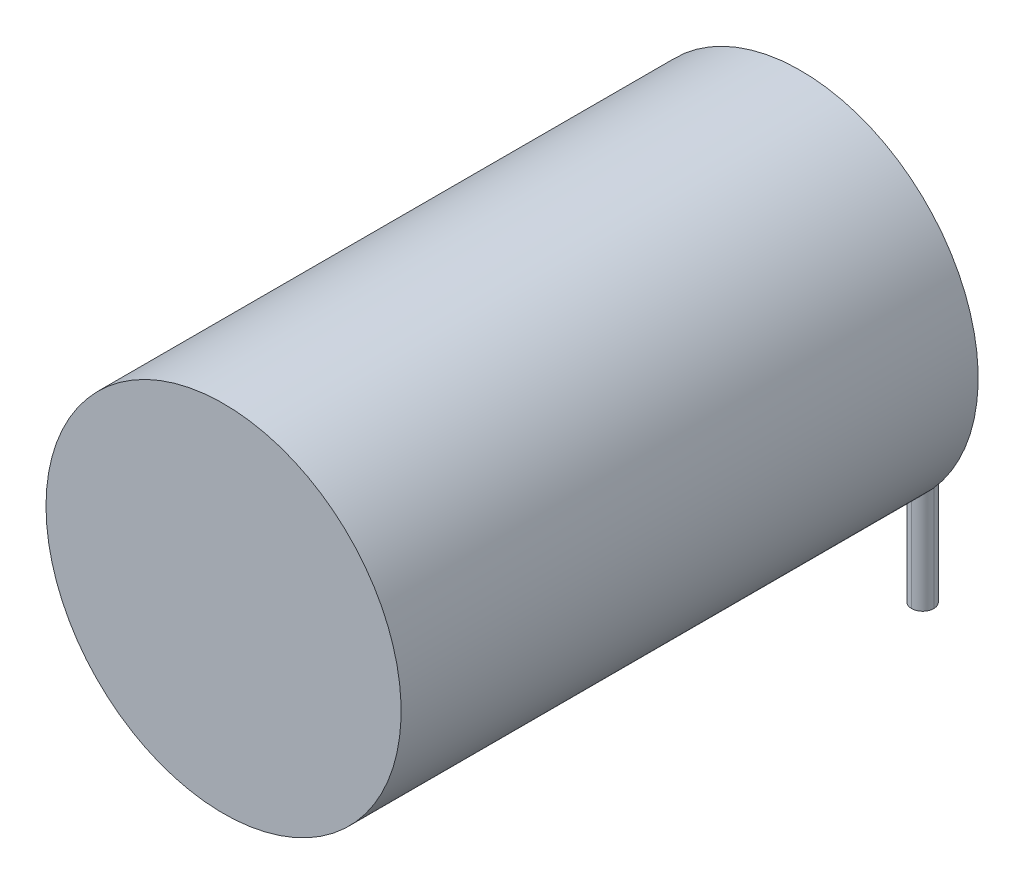
ISO-10303-21;
HEADER;
FILE_DESCRIPTION(('STEP AP214'),'2;1');
FILE_NAME('part.step','',(''),(''),'','','');
FILE_SCHEMA(('AUTOMOTIVE_DESIGN { 1 0 10303 214 1 1 1 1 }'));
ENDSEC;
DATA;
#1=APPLICATION_CONTEXT('core data for automotive mechanical design processes');
#2=APPLICATION_PROTOCOL_DEFINITION('international standard','automotive_design',2000,#1);
#3=PRODUCT_CONTEXT('',#1,'mechanical');
#4=PRODUCT('Part','Part','',(#3));
#5=PRODUCT_RELATED_PRODUCT_CATEGORY('part','',(#4));
#6=PRODUCT_DEFINITION_FORMATION('','',#4);
#7=PRODUCT_DEFINITION_CONTEXT('part definition',#1,'design');
#8=PRODUCT_DEFINITION('design','',#6,#7);
#9=PRODUCT_DEFINITION_SHAPE('','',#8);
#10=(LENGTH_UNIT() NAMED_UNIT(*) SI_UNIT(.MILLI.,.METRE.));
#11=(NAMED_UNIT(*) PLANE_ANGLE_UNIT() SI_UNIT($,.RADIAN.));
#12=(NAMED_UNIT(*) SI_UNIT($,.STERADIAN.) SOLID_ANGLE_UNIT());
#13=UNCERTAINTY_MEASURE_WITH_UNIT(LENGTH_MEASURE(1.E-05),#10,'distance_accuracy_value','');
#14=(GEOMETRIC_REPRESENTATION_CONTEXT(3) GLOBAL_UNCERTAINTY_ASSIGNED_CONTEXT((#13)) GLOBAL_UNIT_ASSIGNED_CONTEXT((#10,
#11,#12)) REPRESENTATION_CONTEXT('',''));
#15=CARTESIAN_POINT('',(0.,0.,0.));
#16=DIRECTION('',(0.,0.,1.));
#17=DIRECTION('',(1.,0.,0.));
#18=AXIS2_PLACEMENT_3D('',#15,#16,#17);
#19=CARTESIAN_POINT('',(2.25,0.249999999999999,-1.));
#20=DIRECTION('',(-1.,0.,0.));
#21=DIRECTION('',(0.,0.,1.));
#22=AXIS2_PLACEMENT_3D('',#19,#20,#21);
#23=PLANE('',#22);
#24=CARTESIAN_POINT('',(2.25,-0.500000000000001,-0.25));
#25=DIRECTION('',(-1.,0.,0.));
#26=DIRECTION('',(0.,0.,1.));
#27=AXIS2_PLACEMENT_3D('',#24,#25,#26);
#28=CIRCLE('',#27,0.5);
#29=CARTESIAN_POINT('',(2.25,-0.500000000000001,-0.75));
#30=VERTEX_POINT('',#29);
#31=CARTESIAN_POINT('',(2.25,0.,-0.25));
#32=VERTEX_POINT('',#31);
#33=EDGE_CURVE('E214',#30,#32,#28,.F.);
#34=ORIENTED_EDGE('',*,*,#33,.F.);
#35=DIRECTION('',(0.,-1.,0.));
#36=VECTOR('',#35,1.);
#37=CARTESIAN_POINT('',(2.25,0.249999999999999,-0.75));
#38=LINE('',#37,#36);
#39=CARTESIAN_POINT('',(2.25,0.,-0.75));
#40=VERTEX_POINT('',#39);
#41=EDGE_CURVE('E220',#30,#40,#38,.F.);
#42=ORIENTED_EDGE('',*,*,#41,.T.);
#43=DIRECTION('',(0.,0.,1.));
#44=VECTOR('',#43,1.);
#45=CARTESIAN_POINT('',(2.25,0.,-1.));
#46=LINE('',#45,#44);
#47=EDGE_CURVE('E217',#40,#32,#46,.T.);
#48=ORIENTED_EDGE('',*,*,#47,.T.);
#49=EDGE_LOOP('',(#34,#42,#48));
#50=FACE_BOUND('',#49,.T.);
#51=ADVANCED_FACE('F35',(#50),#23,.F.);
#52=CARTESIAN_POINT('',(1.75,0.249999999999999,-1.));
#53=DIRECTION('',(1.,0.,0.));
#54=DIRECTION('',(0.,0.,-1.));
#55=AXIS2_PLACEMENT_3D('',#52,#53,#54);
#56=PLANE('',#55);
#57=CARTESIAN_POINT('',(1.75,-0.500000000000001,-0.25));
#58=DIRECTION('',(1.,0.,0.));
#59=DIRECTION('',(0.,0.,-1.));
#60=AXIS2_PLACEMENT_3D('',#57,#58,#59);
#61=CIRCLE('',#60,0.5);
#62=CARTESIAN_POINT('',(1.75,0.,-0.25));
#63=VERTEX_POINT('',#62);
#64=CARTESIAN_POINT('',(1.75,-0.500000000000001,-0.75));
#65=VERTEX_POINT('',#64);
#66=EDGE_CURVE('E233',#63,#65,#61,.F.);
#67=ORIENTED_EDGE('',*,*,#66,.F.);
#68=DIRECTION('',(0.,0.,1.));
#69=VECTOR('',#68,1.);
#70=CARTESIAN_POINT('',(1.75,0.,-1.));
#71=LINE('',#70,#69);
#72=CARTESIAN_POINT('',(1.75,0.,-0.75));
#73=VERTEX_POINT('',#72);
#74=EDGE_CURVE('E236',#63,#73,#71,.F.);
#75=ORIENTED_EDGE('',*,*,#74,.T.);
#76=DIRECTION('',(0.,1.,0.));
#77=VECTOR('',#76,1.);
#78=CARTESIAN_POINT('',(1.75,-5.75,-0.75));
#79=LINE('',#78,#77);
#80=EDGE_CURVE('E118',#73,#65,#79,.F.);
#81=ORIENTED_EDGE('',*,*,#80,.T.);
#82=EDGE_LOOP('',(#67,#75,#81));
#83=FACE_BOUND('',#82,.T.);
#84=ADVANCED_FACE('F297',(#83),#56,.F.);
#85=CARTESIAN_POINT('',(0.,0.,0.));
#86=DIRECTION('',(0.,0.,1.));
#87=DIRECTION('',(1.,0.,0.));
#88=AXIS2_PLACEMENT_3D('',#85,#86,#87);
#89=PLANE('',#88);
#90=CARTESIAN_POINT('',(2.,0.,0.));
#91=DIRECTION('',(0.,0.,1.));
#92=DIRECTION('',(1.,0.,0.));
#93=AXIS2_PLACEMENT_3D('',#90,#91,#92);
#94=CIRCLE('',#93,0.25);
#95=CARTESIAN_POINT('',(2.25,0.,0.));
#96=VERTEX_POINT('',#95);
#97=CARTESIAN_POINT('',(2.,0.249999999999999,0.));
#98=VERTEX_POINT('',#97);
#99=EDGE_CURVE('E45',#96,#98,#94,.T.);
#100=ORIENTED_EDGE('',*,*,#99,.T.);
#101=CARTESIAN_POINT('',(2.,0.,0.));
#102=DIRECTION('',(0.,0.,1.));
#103=DIRECTION('',(1.,0.,0.));
#104=AXIS2_PLACEMENT_3D('',#101,#102,#103);
#105=CIRCLE('',#104,0.25);
#106=CARTESIAN_POINT('',(1.75,0.,0.));
#107=VERTEX_POINT('',#106);
#108=EDGE_CURVE('E11',#98,#107,#105,.T.);
#109=ORIENTED_EDGE('',*,*,#108,.T.);
#110=CARTESIAN_POINT('',(2.,0.,0.));
#111=DIRECTION('',(0.,0.,1.));
#112=DIRECTION('',(1.,0.,0.));
#113=AXIS2_PLACEMENT_3D('',#110,#111,#112);
#114=CIRCLE('',#113,0.25);
#115=CARTESIAN_POINT('',(2.,-0.250000000000001,0.));
#116=VERTEX_POINT('',#115);
#117=EDGE_CURVE('E199',#107,#116,#114,.T.);
#118=ORIENTED_EDGE('',*,*,#117,.T.);
#119=CARTESIAN_POINT('',(2.,0.,0.));
#120=DIRECTION('',(0.,0.,1.));
#121=DIRECTION('',(1.,0.,0.));
#122=AXIS2_PLACEMENT_3D('',#119,#120,#121);
#123=CIRCLE('',#122,0.25);
#124=EDGE_CURVE('E197',#116,#96,#123,.T.);
#125=ORIENTED_EDGE('',*,*,#124,.T.);
#126=EDGE_LOOP('',(#100,#109,#118,#125));
#127=FACE_BOUND('',#126,.T.);
#128=CARTESIAN_POINT('',(-2.,0.,0.));
#129=DIRECTION('',(0.,0.,1.));
#130=DIRECTION('',(1.,0.,0.));
#131=AXIS2_PLACEMENT_3D('',#128,#129,#130);
#132=CIRCLE('',#131,0.25);
#133=CARTESIAN_POINT('',(-2.,0.25,0.));
#134=VERTEX_POINT('',#133);
#135=CARTESIAN_POINT('',(-2.25,0.,0.));
#136=VERTEX_POINT('',#135);
#137=EDGE_CURVE('E208',#134,#136,#132,.T.);
#138=ORIENTED_EDGE('',*,*,#137,.T.);
#139=CARTESIAN_POINT('',(-2.,0.,0.));
#140=DIRECTION('',(0.,0.,1.));
#141=DIRECTION('',(1.,0.,0.));
#142=AXIS2_PLACEMENT_3D('',#139,#140,#141);
#143=CIRCLE('',#142,0.25);
#144=CARTESIAN_POINT('',(-2.,-0.250000000000001,0.));
#145=VERTEX_POINT('',#144);
#146=EDGE_CURVE('E202',#136,#145,#143,.T.);
#147=ORIENTED_EDGE('',*,*,#146,.T.);
#148=CARTESIAN_POINT('',(-2.,0.,0.));
#149=DIRECTION('',(0.,0.,1.));
#150=DIRECTION('',(1.,0.,0.));
#151=AXIS2_PLACEMENT_3D('',#148,#149,#150);
#152=CIRCLE('',#151,0.25);
#153=CARTESIAN_POINT('',(-1.75,0.,0.));
#154=VERTEX_POINT('',#153);
#155=EDGE_CURVE('E205',#145,#154,#152,.T.);
#156=ORIENTED_EDGE('',*,*,#155,.T.);
#157=CARTESIAN_POINT('',(-2.,0.,0.));
#158=DIRECTION('',(0.,0.,1.));
#159=DIRECTION('',(1.,0.,0.));
#160=AXIS2_PLACEMENT_3D('',#157,#158,#159);
#161=CIRCLE('',#160,0.25);
#162=EDGE_CURVE('E211',#154,#134,#161,.T.);
#163=ORIENTED_EDGE('',*,*,#162,.T.);
#164=EDGE_LOOP('',(#138,#147,#156,#163));
#165=FACE_BOUND('',#164,.T.);
#166=CARTESIAN_POINT('',(0.,0.,0.));
#167=DIRECTION('',(0.,0.,1.));
#168=DIRECTION('',(1.,0.,0.));
#169=AXIS2_PLACEMENT_3D('',#166,#167,#168);
#170=CIRCLE('',#169,4.);
#171=CARTESIAN_POINT('',(-4.,0.,0.));
#172=VERTEX_POINT('',#171);
#173=EDGE_CURVE('E267',#172,#172,#170,.T.);
#174=ORIENTED_EDGE('',*,*,#173,.F.);
#175=EDGE_LOOP('',(#174));
#176=FACE_BOUND('',#175,.T.);
#177=ADVANCED_FACE('F292',(#127,#165,#176),#89,.F.);
#178=CARTESIAN_POINT('',(0.,0.,13.));
#179=DIRECTION('',(0.,0.,-1.));
#180=DIRECTION('',(-1.,0.,0.));
#181=AXIS2_PLACEMENT_3D('',#178,#179,#180);
#182=CYLINDRICAL_SURFACE('',#181,4.);
#183=CARTESIAN_POINT('',(0.,0.,13.));
#184=DIRECTION('',(0.,0.,1.));
#185=DIRECTION('',(1.,0.,0.));
#186=AXIS2_PLACEMENT_3D('',#183,#184,#185);
#187=CIRCLE('',#186,4.);
#188=CARTESIAN_POINT('',(-4.,0.,13.));
#189=VERTEX_POINT('',#188);
#190=EDGE_CURVE('E281',#189,#189,#187,.T.);
#191=CARTESIAN_POINT('',(-4.,0.,13.));
#192=CARTESIAN_POINT('',(-4.,0.,12.8645833333333));
#193=CARTESIAN_POINT('',(-4.,0.,12.7291666666667));
#194=CARTESIAN_POINT('',(-4.,0.,12.4583333333333));
#195=CARTESIAN_POINT('',(-4.,0.,12.3229166666667));
#196=CARTESIAN_POINT('',(-4.,0.,12.0520833333333));
#197=CARTESIAN_POINT('',(-4.,0.,11.9166666666667));
#198=CARTESIAN_POINT('',(-4.,0.,11.6458333333333));
#199=CARTESIAN_POINT('',(-4.,0.,11.5104166666667));
#200=CARTESIAN_POINT('',(-4.,0.,11.2395833333333));
#201=CARTESIAN_POINT('',(-4.,0.,11.1041666666667));
#202=CARTESIAN_POINT('',(-4.,0.,10.8333333333333));
#203=CARTESIAN_POINT('',(-4.,0.,10.6979166666667));
#204=CARTESIAN_POINT('',(-4.,0.,10.4270833333333));
#205=CARTESIAN_POINT('',(-4.,0.,10.2916666666667));
#206=CARTESIAN_POINT('',(-4.,0.,10.0208333333333));
#207=CARTESIAN_POINT('',(-4.,0.,9.88541666666667));
#208=CARTESIAN_POINT('',(-4.,0.,9.61458333333333));
#209=CARTESIAN_POINT('',(-4.,0.,9.47916666666667));
#210=CARTESIAN_POINT('',(-4.,0.,9.20833333333333));
#211=CARTESIAN_POINT('',(-4.,0.,9.07291666666667));
#212=CARTESIAN_POINT('',(-4.,0.,8.80208333333333));
#213=CARTESIAN_POINT('',(-4.,0.,8.66666666666667));
#214=CARTESIAN_POINT('',(-4.,0.,8.39583333333333));
#215=CARTESIAN_POINT('',(-4.,0.,8.26041666666667));
#216=CARTESIAN_POINT('',(-4.,0.,7.98958333333333));
#217=CARTESIAN_POINT('',(-4.,0.,7.85416666666667));
#218=CARTESIAN_POINT('',(-4.,0.,7.58333333333333));
#219=CARTESIAN_POINT('',(-4.,0.,7.44791666666667));
#220=CARTESIAN_POINT('',(-4.,0.,7.17708333333333));
#221=CARTESIAN_POINT('',(-4.,0.,7.04166666666667));
#222=CARTESIAN_POINT('',(-4.,0.,6.77083333333333));
#223=CARTESIAN_POINT('',(-4.,0.,6.63541666666667));
#224=CARTESIAN_POINT('',(-4.,0.,6.36458333333333));
#225=CARTESIAN_POINT('',(-4.,0.,6.22916666666667));
#226=CARTESIAN_POINT('',(-4.,0.,5.95833333333333));
#227=CARTESIAN_POINT('',(-4.,0.,5.82291666666667));
#228=CARTESIAN_POINT('',(-4.,0.,5.55208333333333));
#229=CARTESIAN_POINT('',(-4.,0.,5.41666666666667));
#230=CARTESIAN_POINT('',(-4.,0.,5.14583333333333));
#231=CARTESIAN_POINT('',(-4.,0.,5.01041666666667));
#232=CARTESIAN_POINT('',(-4.,0.,4.73958333333333));
#233=CARTESIAN_POINT('',(-4.,0.,4.60416666666667));
#234=CARTESIAN_POINT('',(-4.,0.,4.33333333333333));
#235=CARTESIAN_POINT('',(-4.,0.,4.19791666666667));
#236=CARTESIAN_POINT('',(-4.,0.,3.92708333333333));
#237=CARTESIAN_POINT('',(-4.,0.,3.79166666666667));
#238=CARTESIAN_POINT('',(-4.,0.,3.52083333333333));
#239=CARTESIAN_POINT('',(-4.,0.,3.38541666666667));
#240=CARTESIAN_POINT('',(-4.,0.,3.11458333333333));
#241=CARTESIAN_POINT('',(-4.,0.,2.97916666666667));
#242=CARTESIAN_POINT('',(-4.,0.,2.70833333333333));
#243=CARTESIAN_POINT('',(-4.,0.,2.57291666666667));
#244=CARTESIAN_POINT('',(-4.,0.,2.30208333333333));
#245=CARTESIAN_POINT('',(-4.,0.,2.16666666666667));
#246=CARTESIAN_POINT('',(-4.,0.,1.89583333333333));
#247=CARTESIAN_POINT('',(-4.,0.,1.76041666666667));
#248=CARTESIAN_POINT('',(-4.,0.,1.48958333333333));
#249=CARTESIAN_POINT('',(-4.,0.,1.35416666666667));
#250=CARTESIAN_POINT('',(-4.,0.,1.08333333333333));
#251=CARTESIAN_POINT('',(-4.,0.,0.947916666666667));
#252=CARTESIAN_POINT('',(-4.,0.,0.677083333333334));
#253=CARTESIAN_POINT('',(-4.,0.,0.541666666666667));
#254=CARTESIAN_POINT('',(-4.,0.,0.270833333333334));
#255=CARTESIAN_POINT('',(-4.,0.,0.135416666666667));
#256=CARTESIAN_POINT('',(-4.,0.,0.));
#257=B_SPLINE_CURVE_WITH_KNOTS('',3,(#191,#192,#193,#194,#195,#196,#197,#198,#199,#200,#201,
#202,#203,#204,#205,#206,#207,#208,#209,#210,#211,#212,#213,#214,#215,#216,#217,#218,#219,#220,
#221,#222,#223,#224,#225,#226,#227,#228,#229,#230,#231,#232,#233,#234,#235,#236,#237,#238,#239,
#240,#241,#242,#243,#244,#245,#246,#247,#248,#249,#250,#251,#252,#253,#254,#255,#256),
.UNSPECIFIED.,.F.,.F.,(4,2,2,2,2,2,2,2,2,2,2,2,2,2,2,2,2,2,2,2,2,2,2,2,2,2,2,2,2,2,2,2,4),(0.,
0.406249999999999,0.812499999999999,1.21875,1.625,2.03125,2.4375,2.84375,3.25,3.65625,4.0625,
4.46875,4.875,5.28125,5.6875,6.09375,6.5,6.90625,7.3125,7.71875,8.125,8.53125,8.9375,9.34375,
9.75,10.15625,10.5625,10.96875,11.375,11.78125,12.1875,12.59375,13.),.UNSPECIFIED.);
#258=EDGE_CURVE('BSEAM289',#189,#172,#257,.T.);
#259=ORIENTED_EDGE('',*,*,#190,.F.);
#260=ORIENTED_EDGE('',*,*,#173,.T.);
#261=ORIENTED_EDGE('',*,*,#258,.T.);
#262=ORIENTED_EDGE('',*,*,#258,.F.);
#263=EDGE_LOOP('',(#259,#261,#260,#262));
#264=FACE_BOUND('',#263,.T.);
#265=ADVANCED_FACE('F289',(#264),#182,.T.);
#266=CARTESIAN_POINT('',(0.,0.,13.));
#267=DIRECTION('',(0.,0.,1.));
#268=DIRECTION('',(1.,0.,0.));
#269=AXIS2_PLACEMENT_3D('',#266,#267,#268);
#270=PLANE('',#269);
#271=ORIENTED_EDGE('',*,*,#190,.T.);
#272=EDGE_LOOP('',(#271));
#273=FACE_BOUND('',#272,.T.);
#274=ADVANCED_FACE('F287',(#273),#270,.T.);
#275=CARTESIAN_POINT('',(-2.25,0.25,-1.));
#276=DIRECTION('',(1.,0.,0.));
#277=DIRECTION('',(0.,0.,-1.));
#278=AXIS2_PLACEMENT_3D('',#275,#276,#277);
#279=PLANE('',#278);
#280=CARTESIAN_POINT('',(-2.25,-0.5,-0.25));
#281=DIRECTION('',(1.,0.,0.));
#282=DIRECTION('',(0.,0.,-1.));
#283=AXIS2_PLACEMENT_3D('',#280,#281,#282);
#284=CIRCLE('',#283,0.5);
#285=CARTESIAN_POINT('',(-2.25,0.,-0.25));
#286=VERTEX_POINT('',#285);
#287=CARTESIAN_POINT('',(-2.25,-0.5,-0.75));
#288=VERTEX_POINT('',#287);
#289=EDGE_CURVE('E252',#286,#288,#284,.F.);
#290=ORIENTED_EDGE('',*,*,#289,.F.);
#291=DIRECTION('',(0.,0.,1.));
#292=VECTOR('',#291,1.);
#293=CARTESIAN_POINT('',(-2.25,0.,-1.));
#294=LINE('',#293,#292);
#295=CARTESIAN_POINT('',(-2.25,0.,-0.75));
#296=VERTEX_POINT('',#295);
#297=EDGE_CURVE('E249',#286,#296,#294,.F.);
#298=ORIENTED_EDGE('',*,*,#297,.T.);
#299=DIRECTION('',(0.,1.,0.));
#300=VECTOR('',#299,1.);
#301=CARTESIAN_POINT('',(-2.25,0.25,-0.75));
#302=LINE('',#301,#300);
#303=EDGE_CURVE('E264',#296,#288,#302,.F.);
#304=ORIENTED_EDGE('',*,*,#303,.T.);
#305=EDGE_LOOP('',(#290,#298,#304));
#306=FACE_BOUND('',#305,.T.);
#307=ADVANCED_FACE('F313',(#306),#279,.F.);
#308=CARTESIAN_POINT('',(-1.75,0.249999999999999,-1.));
#309=DIRECTION('',(-1.,0.,0.));
#310=DIRECTION('',(0.,0.,1.));
#311=AXIS2_PLACEMENT_3D('',#308,#309,#310);
#312=PLANE('',#311);
#313=DIRECTION('',(0.,-1.,0.));
#314=VECTOR('',#313,1.);
#315=CARTESIAN_POINT('',(-1.75,0.249999999999999,-0.75));
#316=LINE('',#315,#314);
#317=CARTESIAN_POINT('',(-1.75,-0.5,-0.75));
#318=VERTEX_POINT('',#317);
#319=CARTESIAN_POINT('',(-1.75,0.,-0.75));
#320=VERTEX_POINT('',#319);
#321=EDGE_CURVE('E274',#318,#320,#316,.F.);
#322=ORIENTED_EDGE('',*,*,#321,.T.);
#323=DIRECTION('',(0.,0.,1.));
#324=VECTOR('',#323,1.);
#325=CARTESIAN_POINT('',(-1.75,0.,-1.));
#326=LINE('',#325,#324);
#327=CARTESIAN_POINT('',(-1.75,0.,-0.25));
#328=VERTEX_POINT('',#327);
#329=EDGE_CURVE('E258',#320,#328,#326,.T.);
#330=ORIENTED_EDGE('',*,*,#329,.T.);
#331=CARTESIAN_POINT('',(-1.75,-0.5,-0.25));
#332=DIRECTION('',(-1.,0.,0.));
#333=DIRECTION('',(0.,0.,1.));
#334=AXIS2_PLACEMENT_3D('',#331,#332,#333);
#335=CIRCLE('',#334,0.5);
#336=EDGE_CURVE('E261',#318,#328,#335,.F.);
#337=ORIENTED_EDGE('',*,*,#336,.F.);
#338=EDGE_LOOP('',(#322,#330,#337));
#339=FACE_BOUND('',#338,.T.);
#340=ADVANCED_FACE('F319',(#339),#312,.F.);
#341=CARTESIAN_POINT('',(0.,-5.75,0.));
#342=DIRECTION('',(0.,-1.,0.));
#343=DIRECTION('',(0.,0.,-1.));
#344=AXIS2_PLACEMENT_3D('',#341,#342,#343);
#345=PLANE('',#344);
#346=CARTESIAN_POINT('',(-2.,-5.75,-0.75));
#347=DIRECTION('',(0.,-1.,0.));
#348=DIRECTION('',(0.,0.,-1.));
#349=AXIS2_PLACEMENT_3D('',#346,#347,#348);
#350=CIRCLE('',#349,0.25);
#351=CARTESIAN_POINT('',(-2.,-5.75,-1.));
#352=VERTEX_POINT('',#351);
#353=CARTESIAN_POINT('',(-1.75,-5.75,-0.75));
#354=VERTEX_POINT('',#353);
#355=EDGE_CURVE('E275',#352,#354,#350,.T.);
#356=ORIENTED_EDGE('',*,*,#355,.T.);
#357=CARTESIAN_POINT('',(-2.,-5.75,-0.75));
#358=DIRECTION('',(0.,-1.,0.));
#359=DIRECTION('',(0.,0.,-1.));
#360=AXIS2_PLACEMENT_3D('',#357,#358,#359);
#361=CIRCLE('',#360,0.25);
#362=CARTESIAN_POINT('',(-2.,-5.75,-0.5));
#363=VERTEX_POINT('',#362);
#364=EDGE_CURVE('E243',#354,#363,#361,.T.);
#365=ORIENTED_EDGE('',*,*,#364,.T.);
#366=CARTESIAN_POINT('',(-2.,-5.75,-0.75));
#367=DIRECTION('',(0.,-1.,0.));
#368=DIRECTION('',(0.,0.,-1.));
#369=AXIS2_PLACEMENT_3D('',#366,#367,#368);
#370=CIRCLE('',#369,0.25);
#371=CARTESIAN_POINT('',(-2.25,-5.75,-0.75));
#372=VERTEX_POINT('',#371);
#373=EDGE_CURVE('E246',#363,#372,#370,.T.);
#374=ORIENTED_EDGE('',*,*,#373,.T.);
#375=CARTESIAN_POINT('',(-2.,-5.75,-0.75));
#376=DIRECTION('',(0.,-1.,0.));
#377=DIRECTION('',(0.,0.,-1.));
#378=AXIS2_PLACEMENT_3D('',#375,#376,#377);
#379=CIRCLE('',#378,0.25);
#380=EDGE_CURVE('E278',#372,#352,#379,.T.);
#381=ORIENTED_EDGE('',*,*,#380,.T.);
#382=EDGE_LOOP('',(#356,#365,#374,#381));
#383=FACE_BOUND('',#382,.T.);
#384=ADVANCED_FACE('F324',(#383),#345,.T.);
#385=CARTESIAN_POINT('',(0.,-5.75,0.));
#386=DIRECTION('',(0.,-1.,0.));
#387=DIRECTION('',(0.,0.,-1.));
#388=AXIS2_PLACEMENT_3D('',#385,#386,#387);
#389=PLANE('',#388);
#390=CARTESIAN_POINT('',(2.,-5.75,-0.75));
#391=DIRECTION('',(0.,-1.,0.));
#392=DIRECTION('',(0.,0.,-1.));
#393=AXIS2_PLACEMENT_3D('',#390,#391,#392);
#394=CIRCLE('',#393,0.25);
#395=CARTESIAN_POINT('',(2.25,-5.75,-0.75));
#396=VERTEX_POINT('',#395);
#397=CARTESIAN_POINT('',(2.,-5.75,-0.5));
#398=VERTEX_POINT('',#397);
#399=EDGE_CURVE('E226',#396,#398,#394,.T.);
#400=ORIENTED_EDGE('',*,*,#399,.T.);
#401=CARTESIAN_POINT('',(2.,-5.75,-0.75));
#402=DIRECTION('',(0.,-1.,0.));
#403=DIRECTION('',(0.,0.,-1.));
#404=AXIS2_PLACEMENT_3D('',#401,#402,#403);
#405=CIRCLE('',#404,0.25);
#406=CARTESIAN_POINT('',(1.75,-5.75,-0.75));
#407=VERTEX_POINT('',#406);
#408=EDGE_CURVE('E223',#398,#407,#405,.T.);
#409=ORIENTED_EDGE('',*,*,#408,.T.);
#410=CARTESIAN_POINT('',(2.,-5.75,-0.75));
#411=DIRECTION('',(0.,-1.,0.));
#412=DIRECTION('',(0.,0.,-1.));
#413=AXIS2_PLACEMENT_3D('',#410,#411,#412);
#414=CIRCLE('',#413,0.25);
#415=CARTESIAN_POINT('',(2.,-5.75,-1.));
#416=VERTEX_POINT('',#415);
#417=EDGE_CURVE('E230',#407,#416,#414,.T.);
#418=ORIENTED_EDGE('',*,*,#417,.T.);
#419=CARTESIAN_POINT('',(2.,-5.75,-0.75));
#420=DIRECTION('',(0.,-1.,0.));
#421=DIRECTION('',(0.,0.,-1.));
#422=AXIS2_PLACEMENT_3D('',#419,#420,#421);
#423=CIRCLE('',#422,0.25);
#424=EDGE_CURVE('E96',#416,#396,#423,.T.);
#425=ORIENTED_EDGE('',*,*,#424,.T.);
#426=EDGE_LOOP('',(#400,#409,#418,#425));
#427=FACE_BOUND('',#426,.T.);
#428=ADVANCED_FACE('F435',(#427),#389,.T.);
#429=CARTESIAN_POINT('',(-2.,0.,-0.75));
#430=DIRECTION('',(0.,1.,0.));
#431=DIRECTION('',(0.,0.,1.));
#432=AXIS2_PLACEMENT_3D('',#429,#430,#431);
#433=CYLINDRICAL_SURFACE('',#432,0.25);
#434=ORIENTED_EDGE('',*,*,#303,.F.);
#435=CARTESIAN_POINT('',(-2.,0.,-0.75));
#436=DIRECTION('',(0.,1.,0.));
#437=DIRECTION('',(0.,0.,1.));
#438=AXIS2_PLACEMENT_3D('',#435,#436,#437);
#439=CIRCLE('',#438,0.25);
#440=CARTESIAN_POINT('',(-2.,0.,-1.));
#441=VERTEX_POINT('',#440);
#442=EDGE_CURVE('E240',#296,#441,#439,.F.);
#443=ORIENTED_EDGE('',*,*,#442,.T.);
#444=DIRECTION('',(0.,1.,0.));
#445=VECTOR('',#444,1.);
#446=CARTESIAN_POINT('',(-2.,0.,-1.));
#447=LINE('',#446,#445);
#448=EDGE_CURVE('E159',#352,#441,#447,.T.);
#449=ORIENTED_EDGE('',*,*,#448,.F.);
#450=ORIENTED_EDGE('',*,*,#380,.F.);
#451=EDGE_CURVE('E268',#288,#372,#302,.F.);
#452=ORIENTED_EDGE('',*,*,#451,.F.);
#453=EDGE_LOOP('',(#434,#443,#449,#450,#452));
#454=FACE_BOUND('',#453,.T.);
#455=ADVANCED_FACE('F478',(#454),#433,.T.);
#456=CARTESIAN_POINT('',(-2.,0.,-0.75));
#457=DIRECTION('',(0.,-1.,0.));
#458=DIRECTION('',(0.,0.,-1.));
#459=AXIS2_PLACEMENT_3D('',#456,#457,#458);
#460=CYLINDRICAL_SURFACE('',#459,0.25);
#461=ORIENTED_EDGE('',*,*,#448,.T.);
#462=CARTESIAN_POINT('',(-2.,0.,-0.75));
#463=DIRECTION('',(0.,-1.,0.));
#464=DIRECTION('',(0.,0.,-1.));
#465=AXIS2_PLACEMENT_3D('',#462,#463,#464);
#466=CIRCLE('',#465,0.25);
#467=EDGE_CURVE('E255',#441,#320,#466,.T.);
#468=ORIENTED_EDGE('',*,*,#467,.T.);
#469=ORIENTED_EDGE('',*,*,#321,.F.);
#470=EDGE_CURVE('E271',#354,#318,#316,.F.);
#471=ORIENTED_EDGE('',*,*,#470,.F.);
#472=ORIENTED_EDGE('',*,*,#355,.F.);
#473=EDGE_LOOP('',(#461,#468,#469,#471,#472));
#474=FACE_BOUND('',#473,.T.);
#475=ADVANCED_FACE('F367',(#474),#460,.T.);
#476=CARTESIAN_POINT('',(-2.,0.25,-0.75));
#477=DIRECTION('',(0.,1.,0.));
#478=DIRECTION('',(0.,0.,1.));
#479=AXIS2_PLACEMENT_3D('',#476,#477,#478);
#480=CYLINDRICAL_SURFACE('',#479,0.25);
#481=ORIENTED_EDGE('',*,*,#451,.T.);
#482=ORIENTED_EDGE('',*,*,#373,.F.);
#483=DIRECTION('',(0.,1.,0.));
#484=VECTOR('',#483,1.);
#485=CARTESIAN_POINT('',(-2.,-5.75,-0.5));
#486=LINE('',#485,#484);
#487=CARTESIAN_POINT('',(-2.,-0.5,-0.5));
#488=VERTEX_POINT('',#487);
#489=EDGE_CURVE('E156',#488,#363,#486,.F.);
#490=ORIENTED_EDGE('',*,*,#489,.F.);
#491=CARTESIAN_POINT('',(-2.,-0.5,-0.75));
#492=DIRECTION('',(0.,1.,0.));
#493=DIRECTION('',(0.,0.,1.));
#494=AXIS2_PLACEMENT_3D('',#491,#492,#493);
#495=CIRCLE('',#494,0.25);
#496=EDGE_CURVE('E160',#288,#488,#495,.T.);
#497=ORIENTED_EDGE('',*,*,#496,.F.);
#498=EDGE_LOOP('',(#481,#482,#490,#497));
#499=FACE_BOUND('',#498,.T.);
#500=ADVANCED_FACE('F496',(#499),#480,.T.);
#501=CARTESIAN_POINT('',(-2.,-5.75,-0.75));
#502=DIRECTION('',(0.,1.,0.));
#503=DIRECTION('',(0.,0.,1.));
#504=AXIS2_PLACEMENT_3D('',#501,#502,#503);
#505=CYLINDRICAL_SURFACE('',#504,0.25);
#506=CARTESIAN_POINT('',(-2.,-0.5,-0.75));
#507=DIRECTION('',(0.,1.,0.));
#508=DIRECTION('',(0.,0.,1.));
#509=AXIS2_PLACEMENT_3D('',#506,#507,#508);
#510=CIRCLE('',#509,0.25);
#511=EDGE_CURVE('E163',#488,#318,#510,.T.);
#512=ORIENTED_EDGE('',*,*,#511,.F.);
#513=ORIENTED_EDGE('',*,*,#489,.T.);
#514=ORIENTED_EDGE('',*,*,#364,.F.);
#515=ORIENTED_EDGE('',*,*,#470,.T.);
#516=EDGE_LOOP('',(#512,#513,#514,#515));
#517=FACE_BOUND('',#516,.T.);
#518=ADVANCED_FACE('F493',(#517),#505,.T.);
#519=CARTESIAN_POINT('',(-2.,-0.5,-0.25));
#520=DIRECTION('',(1.,0.,0.));
#521=DIRECTION('',(0.,0.,-1.));
#522=AXIS2_PLACEMENT_3D('',#519,#520,#521);
#523=TOROIDAL_SURFACE('',#522,0.5,0.25);
#524=ORIENTED_EDGE('',*,*,#496,.T.);
#525=CARTESIAN_POINT('',(-2.,-0.5,-0.25));
#526=DIRECTION('',(-1.,0.,0.));
#527=DIRECTION('',(0.,0.,1.));
#528=AXIS2_PLACEMENT_3D('',#525,#526,#527);
#529=CIRCLE('',#528,0.25);
#530=CARTESIAN_POINT('',(-2.,-0.250000000000001,-0.25));
#531=VERTEX_POINT('',#530);
#532=EDGE_CURVE('E166',#531,#488,#529,.T.);
#533=ORIENTED_EDGE('',*,*,#532,.F.);
#534=CARTESIAN_POINT('',(-2.,0.,-0.25));
#535=DIRECTION('',(0.,0.,-1.));
#536=DIRECTION('',(-1.,0.,0.));
#537=AXIS2_PLACEMENT_3D('',#534,#535,#536);
#538=CIRCLE('',#537,0.25);
#539=EDGE_CURVE('E169',#286,#531,#538,.F.);
#540=ORIENTED_EDGE('',*,*,#539,.F.);
#541=ORIENTED_EDGE('',*,*,#289,.T.);
#542=EDGE_LOOP('',(#524,#533,#540,#541));
#543=FACE_BOUND('',#542,.T.);
#544=ADVANCED_FACE('F339',(#543),#523,.T.);
#545=CARTESIAN_POINT('',(-2.,0.,-0.75));
#546=DIRECTION('',(0.,-1.,0.));
#547=DIRECTION('',(1.,0.,0.));
#548=AXIS2_PLACEMENT_3D('',#545,#546,#547);
#549=SPHERICAL_SURFACE('',#548,0.25);
#550=CARTESIAN_POINT('',(-2.,0.,-0.75));
#551=DIRECTION('',(1.,0.,0.));
#552=DIRECTION('',(0.,0.,-1.));
#553=AXIS2_PLACEMENT_3D('',#550,#551,#552);
#554=CIRCLE('',#553,0.25);
#555=CARTESIAN_POINT('',(-2.,0.25,-0.75));
#556=VERTEX_POINT('',#555);
#557=EDGE_CURVE('E178',#441,#556,#554,.T.);
#558=ORIENTED_EDGE('',*,*,#557,.F.);
#559=ORIENTED_EDGE('',*,*,#442,.F.);
#560=CARTESIAN_POINT('',(-2.,0.,-0.75));
#561=DIRECTION('',(0.,0.,1.));
#562=DIRECTION('',(1.,0.,0.));
#563=AXIS2_PLACEMENT_3D('',#560,#561,#562);
#564=CIRCLE('',#563,0.25);
#565=EDGE_CURVE('E175',#556,#296,#564,.T.);
#566=ORIENTED_EDGE('',*,*,#565,.F.);
#567=EDGE_LOOP('',(#558,#559,#566));
#568=FACE_BOUND('',#567,.T.);
#569=ADVANCED_FACE('F355',(#568),#549,.T.);
#570=CARTESIAN_POINT('',(-2.,-0.5,-0.25));
#571=DIRECTION('',(-1.,0.,0.));
#572=DIRECTION('',(0.,0.,1.));
#573=AXIS2_PLACEMENT_3D('',#570,#571,#572);
#574=TOROIDAL_SURFACE('',#573,0.5,0.25);
#575=ORIENTED_EDGE('',*,*,#511,.T.);
#576=ORIENTED_EDGE('',*,*,#336,.T.);
#577=CARTESIAN_POINT('',(-2.,0.,-0.25));
#578=DIRECTION('',(0.,0.,-1.));
#579=DIRECTION('',(-1.,0.,0.));
#580=AXIS2_PLACEMENT_3D('',#577,#578,#579);
#581=CIRCLE('',#580,0.25);
#582=EDGE_CURVE('E181',#531,#328,#581,.F.);
#583=ORIENTED_EDGE('',*,*,#582,.F.);
#584=ORIENTED_EDGE('',*,*,#532,.T.);
#585=EDGE_LOOP('',(#575,#576,#583,#584));
#586=FACE_BOUND('',#585,.T.);
#587=ADVANCED_FACE('F377',(#586),#574,.T.);
#588=CARTESIAN_POINT('',(-2.,0.,-1.));
#589=DIRECTION('',(0.,0.,1.));
#590=DIRECTION('',(1.,0.,0.));
#591=AXIS2_PLACEMENT_3D('',#588,#589,#590);
#592=CYLINDRICAL_SURFACE('',#591,0.25);
#593=DIRECTION('',(0.,0.,1.));
#594=VECTOR('',#593,1.);
#595=CARTESIAN_POINT('',(-2.,-0.250000000000001,-1.));
#596=LINE('',#595,#594);
#597=EDGE_CURVE('E184',#145,#531,#596,.F.);
#598=ORIENTED_EDGE('',*,*,#597,.F.);
#599=ORIENTED_EDGE('',*,*,#146,.F.);
#600=DIRECTION('',(0.,0.,1.));
#601=VECTOR('',#600,1.);
#602=CARTESIAN_POINT('',(-2.25,0.,-1.));
#603=LINE('',#602,#601);
#604=EDGE_CURVE('E172',#286,#136,#603,.T.);
#605=ORIENTED_EDGE('',*,*,#604,.F.);
#606=ORIENTED_EDGE('',*,*,#539,.T.);
#607=EDGE_LOOP('',(#598,#599,#605,#606));
#608=FACE_BOUND('',#607,.T.);
#609=ADVANCED_FACE('F344',(#608),#592,.T.);
#610=CARTESIAN_POINT('',(-2.,0.,-1.));
#611=DIRECTION('',(0.,0.,1.));
#612=DIRECTION('',(1.,0.,0.));
#613=AXIS2_PLACEMENT_3D('',#610,#611,#612);
#614=CYLINDRICAL_SURFACE('',#613,0.25);
#615=ORIENTED_EDGE('',*,*,#604,.T.);
#616=ORIENTED_EDGE('',*,*,#137,.F.);
#617=DIRECTION('',(0.,0.,1.));
#618=VECTOR('',#617,1.);
#619=CARTESIAN_POINT('',(-2.,0.25,-1.));
#620=LINE('',#619,#618);
#621=EDGE_CURVE('E187',#556,#134,#620,.T.);
#622=ORIENTED_EDGE('',*,*,#621,.F.);
#623=ORIENTED_EDGE('',*,*,#565,.T.);
#624=ORIENTED_EDGE('',*,*,#297,.F.);
#625=EDGE_LOOP('',(#615,#616,#622,#623,#624));
#626=FACE_BOUND('',#625,.T.);
#627=ADVANCED_FACE('F348',(#626),#614,.T.);
#628=CARTESIAN_POINT('',(-2.,0.,-0.75));
#629=DIRECTION('',(0.,-1.,0.));
#630=DIRECTION('',(1.,0.,0.));
#631=AXIS2_PLACEMENT_3D('',#628,#629,#630);
#632=SPHERICAL_SURFACE('',#631,0.25);
#633=ORIENTED_EDGE('',*,*,#467,.F.);
#634=ORIENTED_EDGE('',*,*,#557,.T.);
#635=CARTESIAN_POINT('',(-2.,0.,-0.75));
#636=DIRECTION('',(0.,0.,1.));
#637=DIRECTION('',(1.,0.,0.));
#638=AXIS2_PLACEMENT_3D('',#635,#636,#637);
#639=CIRCLE('',#638,0.25);
#640=EDGE_CURVE('E190',#320,#556,#639,.T.);
#641=ORIENTED_EDGE('',*,*,#640,.F.);
#642=EDGE_LOOP('',(#633,#634,#641));
#643=FACE_BOUND('',#642,.T.);
#644=ADVANCED_FACE('F359',(#643),#632,.T.);
#645=CARTESIAN_POINT('',(-2.,0.,-1.));
#646=DIRECTION('',(0.,0.,1.));
#647=DIRECTION('',(1.,0.,0.));
#648=AXIS2_PLACEMENT_3D('',#645,#646,#647);
#649=CYLINDRICAL_SURFACE('',#648,0.25);
#650=ORIENTED_EDGE('',*,*,#597,.T.);
#651=ORIENTED_EDGE('',*,*,#582,.T.);
#652=DIRECTION('',(0.,0.,1.));
#653=VECTOR('',#652,1.);
#654=CARTESIAN_POINT('',(-1.75,0.,-1.));
#655=LINE('',#654,#653);
#656=EDGE_CURVE('E193',#154,#328,#655,.F.);
#657=ORIENTED_EDGE('',*,*,#656,.F.);
#658=ORIENTED_EDGE('',*,*,#155,.F.);
#659=EDGE_LOOP('',(#650,#651,#657,#658));
#660=FACE_BOUND('',#659,.T.);
#661=ADVANCED_FACE('F470',(#660),#649,.T.);
#662=CARTESIAN_POINT('',(-2.,0.,-1.));
#663=DIRECTION('',(0.,0.,1.));
#664=DIRECTION('',(1.,0.,0.));
#665=AXIS2_PLACEMENT_3D('',#662,#663,#664);
#666=CYLINDRICAL_SURFACE('',#665,0.25);
#667=ORIENTED_EDGE('',*,*,#640,.T.);
#668=ORIENTED_EDGE('',*,*,#621,.T.);
#669=ORIENTED_EDGE('',*,*,#162,.F.);
#670=ORIENTED_EDGE('',*,*,#656,.T.);
#671=ORIENTED_EDGE('',*,*,#329,.F.);
#672=EDGE_LOOP('',(#667,#668,#669,#670,#671));
#673=FACE_BOUND('',#672,.T.);
#674=ADVANCED_FACE('F466',(#673),#666,.T.);
#675=CARTESIAN_POINT('',(2.,0.,-0.75));
#676=DIRECTION('',(0.,1.,0.));
#677=DIRECTION('',(0.,0.,1.));
#678=AXIS2_PLACEMENT_3D('',#675,#676,#677);
#679=CYLINDRICAL_SURFACE('',#678,0.25);
#680=DIRECTION('',(0.,-1.,0.));
#681=VECTOR('',#680,1.);
#682=CARTESIAN_POINT('',(2.25,0.249999999999999,-0.75));
#683=LINE('',#682,#681);
#684=EDGE_CURVE('E39',#396,#30,#683,.F.);
#685=ORIENTED_EDGE('',*,*,#684,.F.);
#686=ORIENTED_EDGE('',*,*,#424,.F.);
#687=DIRECTION('',(0.,-1.,0.));
#688=VECTOR('',#687,1.);
#689=CARTESIAN_POINT('',(2.,-5.75,-1.));
#690=LINE('',#689,#688);
#691=CARTESIAN_POINT('',(2.,0.,-1.));
#692=VERTEX_POINT('',#691);
#693=EDGE_CURVE('E86',#692,#416,#690,.T.);
#694=ORIENTED_EDGE('',*,*,#693,.F.);
#695=CARTESIAN_POINT('',(2.,0.,-0.75));
#696=DIRECTION('',(0.,1.,0.));
#697=DIRECTION('',(0.,0.,1.));
#698=AXIS2_PLACEMENT_3D('',#695,#696,#697);
#699=CIRCLE('',#698,0.25);
#700=EDGE_CURVE('E92',#40,#692,#699,.T.);
#701=ORIENTED_EDGE('',*,*,#700,.F.);
#702=ORIENTED_EDGE('',*,*,#41,.F.);
#703=EDGE_LOOP('',(#685,#686,#694,#701,#702));
#704=FACE_BOUND('',#703,.T.);
#705=ADVANCED_FACE('F37',(#704),#679,.T.);
#706=CARTESIAN_POINT('',(2.,-5.75,-0.75));
#707=DIRECTION('',(0.,1.,0.));
#708=DIRECTION('',(0.,0.,1.));
#709=AXIS2_PLACEMENT_3D('',#706,#707,#708);
#710=CYLINDRICAL_SURFACE('',#709,0.25);
#711=ORIENTED_EDGE('',*,*,#399,.F.);
#712=ORIENTED_EDGE('',*,*,#684,.T.);
#713=CARTESIAN_POINT('',(2.,-0.500000000000001,-0.75));
#714=DIRECTION('',(0.,1.,0.));
#715=DIRECTION('',(0.,0.,1.));
#716=AXIS2_PLACEMENT_3D('',#713,#714,#715);
#717=CIRCLE('',#716,0.25);
#718=CARTESIAN_POINT('',(2.,-0.500000000000001,-0.5));
#719=VERTEX_POINT('',#718);
#720=EDGE_CURVE('E79',#719,#30,#717,.T.);
#721=ORIENTED_EDGE('',*,*,#720,.F.);
#722=DIRECTION('',(0.,1.,0.));
#723=VECTOR('',#722,1.);
#724=CARTESIAN_POINT('',(2.,-5.75,-0.5));
#725=LINE('',#724,#723);
#726=EDGE_CURVE('E129',#398,#719,#725,.T.);
#727=ORIENTED_EDGE('',*,*,#726,.F.);
#728=EDGE_LOOP('',(#711,#712,#721,#727));
#729=FACE_BOUND('',#728,.T.);
#730=ADVANCED_FACE('F432',(#729),#710,.T.);
#731=CARTESIAN_POINT('',(2.,0.,-0.75));
#732=DIRECTION('',(0.,-1.,0.));
#733=DIRECTION('',(0.,0.,-1.));
#734=AXIS2_PLACEMENT_3D('',#731,#732,#733);
#735=CYLINDRICAL_SURFACE('',#734,0.25);
#736=CARTESIAN_POINT('',(2.,0.,-0.75));
#737=DIRECTION('',(0.,1.,0.));
#738=DIRECTION('',(0.,0.,1.));
#739=AXIS2_PLACEMENT_3D('',#736,#737,#738);
#740=CIRCLE('',#739,0.25);
#741=EDGE_CURVE('E106',#692,#73,#740,.T.);
#742=ORIENTED_EDGE('',*,*,#741,.F.);
#743=ORIENTED_EDGE('',*,*,#693,.T.);
#744=ORIENTED_EDGE('',*,*,#417,.F.);
#745=DIRECTION('',(0.,1.,0.));
#746=VECTOR('',#745,1.);
#747=CARTESIAN_POINT('',(1.75,-5.75,-0.75));
#748=LINE('',#747,#746);
#749=EDGE_CURVE('E119',#65,#407,#748,.F.);
#750=ORIENTED_EDGE('',*,*,#749,.F.);
#751=ORIENTED_EDGE('',*,*,#80,.F.);
#752=EDGE_LOOP('',(#742,#743,#744,#750,#751));
#753=FACE_BOUND('',#752,.T.);
#754=ADVANCED_FACE('F115',(#753),#735,.T.);
#755=CARTESIAN_POINT('',(2.,0.,-0.75));
#756=DIRECTION('',(0.,0.,1.));
#757=DIRECTION('',(1.,0.,0.));
#758=AXIS2_PLACEMENT_3D('',#755,#756,#757);
#759=SPHERICAL_SURFACE('',#758,0.25);
#760=ORIENTED_EDGE('',*,*,#700,.T.);
#761=CARTESIAN_POINT('',(2.,0.,-0.75));
#762=DIRECTION('',(-1.,0.,0.));
#763=DIRECTION('',(0.,0.,1.));
#764=AXIS2_PLACEMENT_3D('',#761,#762,#763);
#765=CIRCLE('',#764,0.25);
#766=CARTESIAN_POINT('',(2.,0.249999999999999,-0.75));
#767=VERTEX_POINT('',#766);
#768=EDGE_CURVE('E103',#767,#692,#765,.T.);
#769=ORIENTED_EDGE('',*,*,#768,.F.);
#770=CARTESIAN_POINT('',(2.,0.,-0.75));
#771=DIRECTION('',(0.,0.,-1.));
#772=DIRECTION('',(-1.,0.,0.));
#773=AXIS2_PLACEMENT_3D('',#770,#771,#772);
#774=CIRCLE('',#773,0.25);
#775=EDGE_CURVE('E112',#40,#767,#774,.F.);
#776=ORIENTED_EDGE('',*,*,#775,.F.);
#777=EDGE_LOOP('',(#760,#769,#776));
#778=FACE_BOUND('',#777,.T.);
#779=ADVANCED_FACE('F121',(#778),#759,.T.);
#780=CARTESIAN_POINT('',(2.,-0.500000000000001,-0.25));
#781=DIRECTION('',(-1.,0.,0.));
#782=DIRECTION('',(0.,0.,1.));
#783=AXIS2_PLACEMENT_3D('',#780,#781,#782);
#784=TOROIDAL_SURFACE('',#783,0.5,0.25);
#785=CARTESIAN_POINT('',(2.,-0.500000000000001,-0.25));
#786=DIRECTION('',(-1.,0.,0.));
#787=DIRECTION('',(0.,0.,1.));
#788=AXIS2_PLACEMENT_3D('',#785,#786,#787);
#789=CIRCLE('',#788,0.25);
#790=CARTESIAN_POINT('',(2.,-0.250000000000001,-0.25));
#791=VERTEX_POINT('',#790);
#792=EDGE_CURVE('E124',#719,#791,#789,.F.);
#793=ORIENTED_EDGE('',*,*,#792,.F.);
#794=ORIENTED_EDGE('',*,*,#720,.T.);
#795=ORIENTED_EDGE('',*,*,#33,.T.);
#796=CARTESIAN_POINT('',(2.,0.,-0.25));
#797=DIRECTION('',(0.,0.,-1.));
#798=DIRECTION('',(-1.,0.,0.));
#799=AXIS2_PLACEMENT_3D('',#796,#797,#798);
#800=CIRCLE('',#799,0.25);
#801=EDGE_CURVE('E138',#791,#32,#800,.F.);
#802=ORIENTED_EDGE('',*,*,#801,.F.);
#803=EDGE_LOOP('',(#793,#794,#795,#802));
#804=FACE_BOUND('',#803,.T.);
#805=ADVANCED_FACE('F430',(#804),#784,.T.);
#806=CARTESIAN_POINT('',(2.,0.249999999999999,-0.75));
#807=DIRECTION('',(0.,1.,0.));
#808=DIRECTION('',(0.,0.,1.));
#809=AXIS2_PLACEMENT_3D('',#806,#807,#808);
#810=CYLINDRICAL_SURFACE('',#809,0.25);
#811=ORIENTED_EDGE('',*,*,#408,.F.);
#812=ORIENTED_EDGE('',*,*,#726,.T.);
#813=CARTESIAN_POINT('',(2.,-0.500000000000001,-0.75));
#814=DIRECTION('',(0.,1.,0.));
#815=DIRECTION('',(0.,0.,1.));
#816=AXIS2_PLACEMENT_3D('',#813,#814,#815);
#817=CIRCLE('',#816,0.25);
#818=EDGE_CURVE('E141',#65,#719,#817,.T.);
#819=ORIENTED_EDGE('',*,*,#818,.F.);
#820=ORIENTED_EDGE('',*,*,#749,.T.);
#821=EDGE_LOOP('',(#811,#812,#819,#820));
#822=FACE_BOUND('',#821,.T.);
#823=ADVANCED_FACE('F438',(#822),#810,.T.);
#824=CARTESIAN_POINT('',(2.,0.,-0.75));
#825=DIRECTION('',(0.,0.,1.));
#826=DIRECTION('',(1.,0.,0.));
#827=AXIS2_PLACEMENT_3D('',#824,#825,#826);
#828=SPHERICAL_SURFACE('',#827,0.25);
#829=ORIENTED_EDGE('',*,*,#768,.T.);
#830=ORIENTED_EDGE('',*,*,#741,.T.);
#831=CARTESIAN_POINT('',(2.,0.,-0.75));
#832=DIRECTION('',(0.,0.,-1.));
#833=DIRECTION('',(-1.,0.,0.));
#834=AXIS2_PLACEMENT_3D('',#831,#832,#833);
#835=CIRCLE('',#834,0.25);
#836=EDGE_CURVE('E108',#767,#73,#835,.F.);
#837=ORIENTED_EDGE('',*,*,#836,.F.);
#838=EDGE_LOOP('',(#829,#830,#837));
#839=FACE_BOUND('',#838,.T.);
#840=ADVANCED_FACE('F104',(#839),#828,.T.);
#841=CARTESIAN_POINT('',(2.,0.,-1.));
#842=DIRECTION('',(0.,0.,1.));
#843=DIRECTION('',(1.,0.,0.));
#844=AXIS2_PLACEMENT_3D('',#841,#842,#843);
#845=CYLINDRICAL_SURFACE('',#844,0.25);
#846=DIRECTION('',(0.,0.,1.));
#847=VECTOR('',#846,1.);
#848=CARTESIAN_POINT('',(2.,0.249999999999999,-1.));
#849=LINE('',#848,#847);
#850=EDGE_CURVE('E145',#98,#767,#849,.F.);
#851=ORIENTED_EDGE('',*,*,#850,.F.);
#852=ORIENTED_EDGE('',*,*,#99,.F.);
#853=DIRECTION('',(0.,0.,1.));
#854=VECTOR('',#853,1.);
#855=CARTESIAN_POINT('',(2.25,0.,-1.));
#856=LINE('',#855,#854);
#857=EDGE_CURVE('E135',#32,#96,#856,.T.);
#858=ORIENTED_EDGE('',*,*,#857,.F.);
#859=ORIENTED_EDGE('',*,*,#47,.F.);
#860=ORIENTED_EDGE('',*,*,#775,.T.);
#861=EDGE_LOOP('',(#851,#852,#858,#859,#860));
#862=FACE_BOUND('',#861,.T.);
#863=ADVANCED_FACE('F428',(#862),#845,.T.);
#864=CARTESIAN_POINT('',(2.,0.,-1.));
#865=DIRECTION('',(0.,0.,1.));
#866=DIRECTION('',(1.,0.,0.));
#867=AXIS2_PLACEMENT_3D('',#864,#865,#866);
#868=CYLINDRICAL_SURFACE('',#867,0.25);
#869=ORIENTED_EDGE('',*,*,#857,.T.);
#870=ORIENTED_EDGE('',*,*,#124,.F.);
#871=DIRECTION('',(0.,0.,1.));
#872=VECTOR('',#871,1.);
#873=CARTESIAN_POINT('',(2.,-0.250000000000001,-1.));
#874=LINE('',#873,#872);
#875=EDGE_CURVE('E147',#791,#116,#874,.T.);
#876=ORIENTED_EDGE('',*,*,#875,.F.);
#877=ORIENTED_EDGE('',*,*,#801,.T.);
#878=EDGE_LOOP('',(#869,#870,#876,#877));
#879=FACE_BOUND('',#878,.T.);
#880=ADVANCED_FACE('F425',(#879),#868,.T.);
#881=CARTESIAN_POINT('',(2.,-0.500000000000001,-0.25));
#882=DIRECTION('',(1.,0.,0.));
#883=DIRECTION('',(0.,0.,-1.));
#884=AXIS2_PLACEMENT_3D('',#881,#882,#883);
#885=TOROIDAL_SURFACE('',#884,0.5,0.25);
#886=ORIENTED_EDGE('',*,*,#818,.T.);
#887=ORIENTED_EDGE('',*,*,#792,.T.);
#888=CARTESIAN_POINT('',(2.,0.,-0.25));
#889=DIRECTION('',(0.,0.,-1.));
#890=DIRECTION('',(-1.,0.,0.));
#891=AXIS2_PLACEMENT_3D('',#888,#889,#890);
#892=CIRCLE('',#891,0.25);
#893=EDGE_CURVE('E150',#63,#791,#892,.F.);
#894=ORIENTED_EDGE('',*,*,#893,.F.);
#895=ORIENTED_EDGE('',*,*,#66,.T.);
#896=EDGE_LOOP('',(#886,#887,#894,#895));
#897=FACE_BOUND('',#896,.T.);
#898=ADVANCED_FACE('F440',(#897),#885,.T.);
#899=CARTESIAN_POINT('',(2.,0.,-1.));
#900=DIRECTION('',(0.,0.,1.));
#901=DIRECTION('',(1.,0.,0.));
#902=AXIS2_PLACEMENT_3D('',#899,#900,#901);
#903=CYLINDRICAL_SURFACE('',#902,0.25);
#904=ORIENTED_EDGE('',*,*,#836,.T.);
#905=ORIENTED_EDGE('',*,*,#74,.F.);
#906=DIRECTION('',(0.,0.,1.));
#907=VECTOR('',#906,1.);
#908=CARTESIAN_POINT('',(1.75,0.,-1.));
#909=LINE('',#908,#907);
#910=EDGE_CURVE('E153',#107,#63,#909,.F.);
#911=ORIENTED_EDGE('',*,*,#910,.F.);
#912=ORIENTED_EDGE('',*,*,#108,.F.);
#913=ORIENTED_EDGE('',*,*,#850,.T.);
#914=EDGE_LOOP('',(#904,#905,#911,#912,#913));
#915=FACE_BOUND('',#914,.T.);
#916=ADVANCED_FACE('F417',(#915),#903,.T.);
#917=CARTESIAN_POINT('',(2.,0.,-1.));
#918=DIRECTION('',(0.,0.,1.));
#919=DIRECTION('',(1.,0.,0.));
#920=AXIS2_PLACEMENT_3D('',#917,#918,#919);
#921=CYLINDRICAL_SURFACE('',#920,0.25);
#922=ORIENTED_EDGE('',*,*,#893,.T.);
#923=ORIENTED_EDGE('',*,*,#875,.T.);
#924=ORIENTED_EDGE('',*,*,#117,.F.);
#925=ORIENTED_EDGE('',*,*,#910,.T.);
#926=EDGE_LOOP('',(#922,#923,#924,#925));
#927=FACE_BOUND('',#926,.T.);
#928=ADVANCED_FACE('F421',(#927),#921,.T.);
#929=CLOSED_SHELL('',(#51,#84,#177,#265,#274,#307,#340,#384,#428,#455,#475,#500,#518,#544,#569,
#587,#609,#627,#644,#661,#674,#705,#730,#754,#779,#805,#823,#840,#863,#880,#898,#916,#928));
#930=MANIFOLD_SOLID_BREP('B2',#929);
#931=ADVANCED_BREP_SHAPE_REPRESENTATION('',(#18,#930),#14);
#932=SHAPE_DEFINITION_REPRESENTATION(#9,#931);
ENDSEC;
END-ISO-10303-21;
